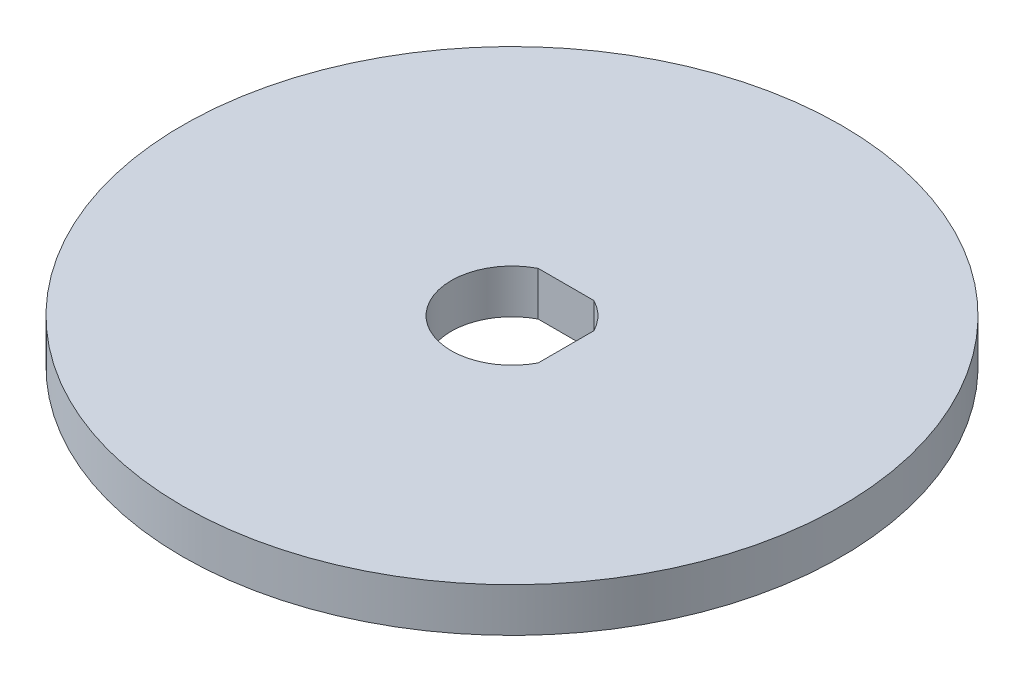
ISO-10303-21;
HEADER;
FILE_DESCRIPTION(('STEP AP214'),'2;1');
FILE_NAME('part.step','',(''),(''),'','','');
FILE_SCHEMA(('AUTOMOTIVE_DESIGN { 1 0 10303 214 1 1 1 1 }'));
ENDSEC;
DATA;
#1=APPLICATION_CONTEXT('core data for automotive mechanical design processes');
#2=APPLICATION_PROTOCOL_DEFINITION('international standard','automotive_design',2000,#1);
#3=PRODUCT_CONTEXT('',#1,'mechanical');
#4=PRODUCT('Part','Part','',(#3));
#5=PRODUCT_RELATED_PRODUCT_CATEGORY('part','',(#4));
#6=PRODUCT_DEFINITION_FORMATION('','',#4);
#7=PRODUCT_DEFINITION_CONTEXT('part definition',#1,'design');
#8=PRODUCT_DEFINITION('design','',#6,#7);
#9=PRODUCT_DEFINITION_SHAPE('','',#8);
#10=(LENGTH_UNIT() NAMED_UNIT(*) SI_UNIT(.MILLI.,.METRE.));
#11=(NAMED_UNIT(*) PLANE_ANGLE_UNIT() SI_UNIT($,.RADIAN.));
#12=(NAMED_UNIT(*) SI_UNIT($,.STERADIAN.) SOLID_ANGLE_UNIT());
#13=UNCERTAINTY_MEASURE_WITH_UNIT(LENGTH_MEASURE(1.E-05),#10,'distance_accuracy_value','');
#14=(GEOMETRIC_REPRESENTATION_CONTEXT(3) GLOBAL_UNCERTAINTY_ASSIGNED_CONTEXT((#13)) GLOBAL_UNIT_ASSIGNED_CONTEXT((#10,
#11,#12)) REPRESENTATION_CONTEXT('',''));
#15=CARTESIAN_POINT('',(0.,0.,0.));
#16=DIRECTION('',(0.,0.,1.));
#17=DIRECTION('',(1.,0.,0.));
#18=AXIS2_PLACEMENT_3D('',#15,#16,#17);
#19=CARTESIAN_POINT('',(0.,0.,0.));
#20=DIRECTION('',(0.,1.,0.));
#21=DIRECTION('',(0.,0.,1.));
#22=AXIS2_PLACEMENT_3D('',#19,#20,#21);
#23=PLANE('',#22);
#24=CARTESIAN_POINT('',(0.,0.,12.5));
#25=DIRECTION('',(0.,1.,0.));
#26=DIRECTION('',(0.,0.,1.));
#27=AXIS2_PLACEMENT_3D('',#24,#25,#26);
#28=CIRCLE('',#27,1.4);
#29=CARTESIAN_POINT('',(0.,0.,13.9));
#30=VERTEX_POINT('',#29);
#31=EDGE_CURVE('E39',#30,#30,#28,.F.);
#32=ORIENTED_EDGE('',*,*,#31,.F.);
#33=EDGE_LOOP('',(#32));
#34=FACE_BOUND('',#33,.T.);
#35=CARTESIAN_POINT('',(0.,0.,0.));
#36=DIRECTION('',(0.,1.,0.));
#37=DIRECTION('',(0.,0.,1.));
#38=AXIS2_PLACEMENT_3D('',#35,#36,#37);
#39=CIRCLE('',#38,22.5);
#40=CARTESIAN_POINT('',(0.,0.,22.5));
#41=VERTEX_POINT('',#40);
#42=EDGE_CURVE('E88',#41,#41,#39,.T.);
#43=ORIENTED_EDGE('',*,*,#42,.F.);
#44=EDGE_LOOP('',(#43));
#45=FACE_BOUND('',#44,.T.);
#46=CARTESIAN_POINT('',(0.,0.,0.));
#47=DIRECTION('',(0.,1.,0.));
#48=DIRECTION('',(0.,0.,-1.));
#49=AXIS2_PLACEMENT_3D('',#46,#47,#48);
#50=CIRCLE('',#49,4.15);
#51=CARTESIAN_POINT('',(3.68951216287465,0.,-1.9));
#52=VERTEX_POINT('',#51);
#53=CARTESIAN_POINT('',(1.9,0.,-3.68951216287465));
#54=VERTEX_POINT('',#53);
#55=EDGE_CURVE('E54',#52,#54,#50,.T.);
#56=ORIENTED_EDGE('',*,*,#55,.T.);
#57=DIRECTION('',(-1.,0.,0.));
#58=VECTOR('',#57,1.);
#59=CARTESIAN_POINT('',(1.9,0.,-3.68951216287465));
#60=LINE('',#59,#58);
#61=CARTESIAN_POINT('',(-1.9,0.,-3.68951216287465));
#62=VERTEX_POINT('',#61);
#63=EDGE_CURVE('E87',#54,#62,#60,.T.);
#64=ORIENTED_EDGE('',*,*,#63,.T.);
#65=CARTESIAN_POINT('',(0.,0.,0.));
#66=DIRECTION('',(0.,1.,0.));
#67=DIRECTION('',(0.,0.,1.));
#68=AXIS2_PLACEMENT_3D('',#65,#66,#67);
#69=CIRCLE('',#68,4.15);
#70=CARTESIAN_POINT('',(3.68951216287465,0.,1.9));
#71=VERTEX_POINT('',#70);
#72=EDGE_CURVE('E103',#62,#71,#69,.T.);
#73=ORIENTED_EDGE('',*,*,#72,.T.);
#74=DIRECTION('',(0.,0.,-1.));
#75=VECTOR('',#74,1.);
#76=CARTESIAN_POINT('',(3.68951216287465,0.,-1.9));
#77=LINE('',#76,#75);
#78=EDGE_CURVE('E81',#71,#52,#77,.T.);
#79=ORIENTED_EDGE('',*,*,#78,.T.);
#80=EDGE_LOOP('',(#56,#64,#73,#79));
#81=FACE_BOUND('',#80,.T.);
#82=CARTESIAN_POINT('',(0.,0.,-12.5));
#83=DIRECTION('',(0.,1.,0.));
#84=DIRECTION('',(0.,0.,1.));
#85=AXIS2_PLACEMENT_3D('',#82,#83,#84);
#86=CIRCLE('',#85,1.4);
#87=CARTESIAN_POINT('',(0.,0.,-11.1));
#88=VERTEX_POINT('',#87);
#89=EDGE_CURVE('E11',#88,#88,#86,.F.);
#90=ORIENTED_EDGE('',*,*,#89,.F.);
#91=EDGE_LOOP('',(#90));
#92=FACE_BOUND('',#91,.T.);
#93=ADVANCED_FACE('F31',(#34,#45,#81,#92),#23,.F.);
#94=CARTESIAN_POINT('',(0.,3.,0.));
#95=DIRECTION('',(0.,1.,0.));
#96=DIRECTION('',(0.,0.,1.));
#97=AXIS2_PLACEMENT_3D('',#94,#95,#96);
#98=PLANE('',#97);
#99=CARTESIAN_POINT('',(0.,3.,0.));
#100=DIRECTION('',(0.,1.,0.));
#101=DIRECTION('',(0.,0.,1.));
#102=AXIS2_PLACEMENT_3D('',#99,#100,#101);
#103=CIRCLE('',#102,22.5);
#104=CARTESIAN_POINT('',(0.,3.,22.5));
#105=VERTEX_POINT('',#104);
#106=EDGE_CURVE('E111',#105,#105,#103,.T.);
#107=ORIENTED_EDGE('',*,*,#106,.T.);
#108=EDGE_LOOP('',(#107));
#109=FACE_BOUND('',#108,.T.);
#110=DIRECTION('',(-1.,0.,0.));
#111=VECTOR('',#110,1.);
#112=CARTESIAN_POINT('',(1.9,3.,-3.68951216287465));
#113=LINE('',#112,#111);
#114=CARTESIAN_POINT('',(1.9,3.,-3.68951216287465));
#115=VERTEX_POINT('',#114);
#116=CARTESIAN_POINT('',(-1.9,3.,-3.68951216287465));
#117=VERTEX_POINT('',#116);
#118=EDGE_CURVE('E80',#115,#117,#113,.T.);
#119=ORIENTED_EDGE('',*,*,#118,.F.);
#120=CARTESIAN_POINT('',(0.,3.,0.));
#121=DIRECTION('',(0.,1.,0.));
#122=DIRECTION('',(0.,0.,-1.));
#123=AXIS2_PLACEMENT_3D('',#120,#121,#122);
#124=CIRCLE('',#123,4.15);
#125=CARTESIAN_POINT('',(3.68951216287465,3.,-1.9));
#126=VERTEX_POINT('',#125);
#127=EDGE_CURVE('E72',#126,#115,#124,.T.);
#128=ORIENTED_EDGE('',*,*,#127,.F.);
#129=DIRECTION('',(0.,0.,-1.));
#130=VECTOR('',#129,1.);
#131=CARTESIAN_POINT('',(3.68951216287465,3.,-1.9));
#132=LINE('',#131,#130);
#133=CARTESIAN_POINT('',(3.68951216287465,3.,1.9));
#134=VERTEX_POINT('',#133);
#135=EDGE_CURVE('E95',#134,#126,#132,.T.);
#136=ORIENTED_EDGE('',*,*,#135,.F.);
#137=CARTESIAN_POINT('',(0.,3.,0.));
#138=DIRECTION('',(0.,1.,0.));
#139=DIRECTION('',(0.,0.,1.));
#140=AXIS2_PLACEMENT_3D('',#137,#138,#139);
#141=CIRCLE('',#140,4.15);
#142=EDGE_CURVE('E93',#117,#134,#141,.T.);
#143=ORIENTED_EDGE('',*,*,#142,.F.);
#144=EDGE_LOOP('',(#119,#128,#136,#143));
#145=FACE_BOUND('',#144,.T.);
#146=ADVANCED_FACE('F92',(#109,#145),#98,.T.);
#147=CARTESIAN_POINT('',(0.,3.,0.));
#148=DIRECTION('',(0.,-1.,0.));
#149=DIRECTION('',(0.,0.,-1.));
#150=AXIS2_PLACEMENT_3D('',#147,#148,#149);
#151=CYLINDRICAL_SURFACE('',#150,22.5);
#152=ORIENTED_EDGE('',*,*,#106,.F.);
#153=EDGE_LOOP('',(#152));
#154=FACE_BOUND('',#153,.T.);
#155=ORIENTED_EDGE('',*,*,#42,.T.);
#156=EDGE_LOOP('',(#155));
#157=FACE_BOUND('',#156,.T.);
#158=ADVANCED_FACE('F33',(#154,#157),#151,.T.);
#159=CARTESIAN_POINT('',(0.,3.,0.));
#160=DIRECTION('',(0.,-1.,0.));
#161=DIRECTION('',(0.,0.,-1.));
#162=AXIS2_PLACEMENT_3D('',#159,#160,#161);
#163=CYLINDRICAL_SURFACE('',#162,4.15);
#164=ORIENTED_EDGE('',*,*,#55,.F.);
#165=DIRECTION('',(0.,-1.,0.));
#166=VECTOR('',#165,1.);
#167=CARTESIAN_POINT('',(3.68951216287465,3.,-1.9));
#168=LINE('',#167,#166);
#169=EDGE_CURVE('E76',#126,#52,#168,.T.);
#170=ORIENTED_EDGE('',*,*,#169,.F.);
#171=ORIENTED_EDGE('',*,*,#127,.T.);
#172=DIRECTION('',(0.,-1.,0.));
#173=VECTOR('',#172,1.);
#174=CARTESIAN_POINT('',(1.9,3.,-3.68951216287465));
#175=LINE('',#174,#173);
#176=EDGE_CURVE('E75',#115,#54,#175,.T.);
#177=ORIENTED_EDGE('',*,*,#176,.T.);
#178=EDGE_LOOP('',(#164,#170,#171,#177));
#179=FACE_BOUND('',#178,.T.);
#180=ADVANCED_FACE('F74',(#179),#163,.F.);
#181=CARTESIAN_POINT('',(1.9,3.,-3.68951216287465));
#182=DIRECTION('',(0.,0.,1.));
#183=DIRECTION('',(1.,0.,0.));
#184=AXIS2_PLACEMENT_3D('',#181,#182,#183);
#185=PLANE('',#184);
#186=ORIENTED_EDGE('',*,*,#63,.F.);
#187=ORIENTED_EDGE('',*,*,#176,.F.);
#188=ORIENTED_EDGE('',*,*,#118,.T.);
#189=DIRECTION('',(0.,-1.,0.));
#190=VECTOR('',#189,1.);
#191=CARTESIAN_POINT('',(-1.9,3.,-3.68951216287465));
#192=LINE('',#191,#190);
#193=EDGE_CURVE('E89',#117,#62,#192,.T.);
#194=ORIENTED_EDGE('',*,*,#193,.T.);
#195=EDGE_LOOP('',(#186,#187,#188,#194));
#196=FACE_BOUND('',#195,.T.);
#197=ADVANCED_FACE('F84',(#196),#185,.T.);
#198=CARTESIAN_POINT('',(0.,3.,0.));
#199=DIRECTION('',(0.,-1.,0.));
#200=DIRECTION('',(0.,0.,-1.));
#201=AXIS2_PLACEMENT_3D('',#198,#199,#200);
#202=CYLINDRICAL_SURFACE('',#201,4.15);
#203=ORIENTED_EDGE('',*,*,#72,.F.);
#204=ORIENTED_EDGE('',*,*,#193,.F.);
#205=ORIENTED_EDGE('',*,*,#142,.T.);
#206=DIRECTION('',(0.,-1.,0.));
#207=VECTOR('',#206,1.);
#208=CARTESIAN_POINT('',(3.68951216287465,3.,1.9));
#209=LINE('',#208,#207);
#210=EDGE_CURVE('E46',#134,#71,#209,.T.);
#211=ORIENTED_EDGE('',*,*,#210,.T.);
#212=EDGE_LOOP('',(#203,#204,#205,#211));
#213=FACE_BOUND('',#212,.T.);
#214=ADVANCED_FACE('F149',(#213),#202,.F.);
#215=CARTESIAN_POINT('',(3.68951216287465,3.,-1.9));
#216=DIRECTION('',(-1.,0.,0.));
#217=DIRECTION('',(0.,0.,1.));
#218=AXIS2_PLACEMENT_3D('',#215,#216,#217);
#219=PLANE('',#218);
#220=ORIENTED_EDGE('',*,*,#78,.F.);
#221=ORIENTED_EDGE('',*,*,#210,.F.);
#222=ORIENTED_EDGE('',*,*,#135,.T.);
#223=ORIENTED_EDGE('',*,*,#169,.T.);
#224=EDGE_LOOP('',(#220,#221,#222,#223));
#225=FACE_BOUND('',#224,.T.);
#226=ADVANCED_FACE('F145',(#225),#219,.T.);
#227=CARTESIAN_POINT('',(0.,-3.,12.5));
#228=DIRECTION('',(0.,1.,0.));
#229=DIRECTION('',(0.,0.,1.));
#230=AXIS2_PLACEMENT_3D('',#227,#228,#229);
#231=CYLINDRICAL_SURFACE('',#230,1.4);
#232=CARTESIAN_POINT('',(0.,-3.,12.5));
#233=DIRECTION('',(0.,-1.,0.));
#234=DIRECTION('',(0.,0.,-1.));
#235=AXIS2_PLACEMENT_3D('',#232,#233,#234);
#236=CIRCLE('',#235,1.4);
#237=CARTESIAN_POINT('',(0.,-3.,11.1));
#238=VERTEX_POINT('',#237);
#239=EDGE_CURVE('E101',#238,#238,#236,.T.);
#240=ORIENTED_EDGE('',*,*,#239,.F.);
#241=EDGE_LOOP('',(#240));
#242=FACE_BOUND('',#241,.T.);
#243=ORIENTED_EDGE('',*,*,#31,.T.);
#244=EDGE_LOOP('',(#243));
#245=FACE_BOUND('',#244,.T.);
#246=ADVANCED_FACE('F118',(#242,#245),#231,.T.);
#247=CARTESIAN_POINT('',(0.,-3.,12.5));
#248=DIRECTION('',(0.,-1.,0.));
#249=DIRECTION('',(0.,0.,-1.));
#250=AXIS2_PLACEMENT_3D('',#247,#248,#249);
#251=PLANE('',#250);
#252=ORIENTED_EDGE('',*,*,#239,.T.);
#253=EDGE_LOOP('',(#252));
#254=FACE_BOUND('',#253,.T.);
#255=ADVANCED_FACE('F130',(#254),#251,.T.);
#256=CARTESIAN_POINT('',(0.,-3.,-12.5));
#257=DIRECTION('',(0.,1.,0.));
#258=DIRECTION('',(0.,0.,1.));
#259=AXIS2_PLACEMENT_3D('',#256,#257,#258);
#260=CYLINDRICAL_SURFACE('',#259,1.4);
#261=CARTESIAN_POINT('',(0.,-3.,-12.5));
#262=DIRECTION('',(0.,-1.,0.));
#263=DIRECTION('',(0.,0.,-1.));
#264=AXIS2_PLACEMENT_3D('',#261,#262,#263);
#265=CIRCLE('',#264,1.4);
#266=CARTESIAN_POINT('',(0.,-3.,-13.9));
#267=VERTEX_POINT('',#266);
#268=EDGE_CURVE('E230',#267,#267,#265,.T.);
#269=ORIENTED_EDGE('',*,*,#268,.F.);
#270=EDGE_LOOP('',(#269));
#271=FACE_BOUND('',#270,.T.);
#272=ORIENTED_EDGE('',*,*,#89,.T.);
#273=EDGE_LOOP('',(#272));
#274=FACE_BOUND('',#273,.T.);
#275=ADVANCED_FACE('F127',(#271,#274),#260,.T.);
#276=CARTESIAN_POINT('',(0.,-3.,-12.5));
#277=DIRECTION('',(0.,-1.,0.));
#278=DIRECTION('',(0.,0.,-1.));
#279=AXIS2_PLACEMENT_3D('',#276,#277,#278);
#280=PLANE('',#279);
#281=ORIENTED_EDGE('',*,*,#268,.T.);
#282=EDGE_LOOP('',(#281));
#283=FACE_BOUND('',#282,.T.);
#284=ADVANCED_FACE('F129',(#283),#280,.T.);
#285=CLOSED_SHELL('',(#93,#146,#158,#180,#197,#214,#226,#246,#255,#275,#284));
#286=MANIFOLD_SOLID_BREP('B2',#285);
#287=ADVANCED_BREP_SHAPE_REPRESENTATION('',(#18,#286),#14);
#288=SHAPE_DEFINITION_REPRESENTATION(#9,#287);
ENDSEC;
END-ISO-10303-21;
